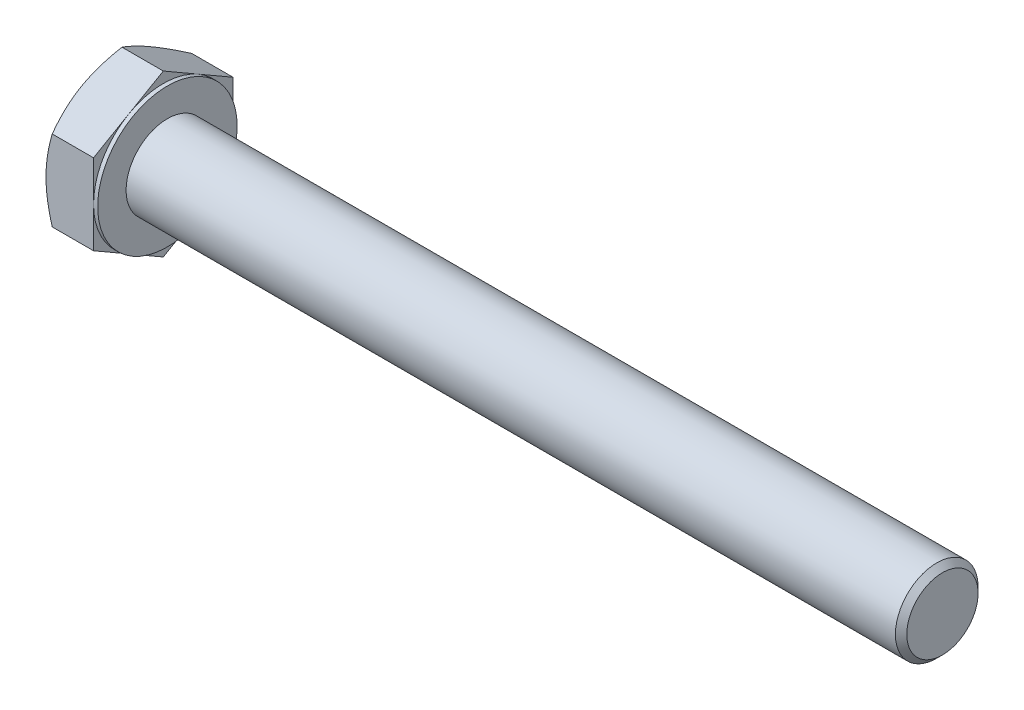
ISO-10303-21;
HEADER;
FILE_DESCRIPTION(('STEP AP214'),'2;1');
FILE_NAME('part.step','',(''),(''),'','','');
FILE_SCHEMA(('AUTOMOTIVE_DESIGN { 1 0 10303 214 1 1 1 1 }'));
ENDSEC;
DATA;
#1=APPLICATION_CONTEXT('core data for automotive mechanical design processes');
#2=APPLICATION_PROTOCOL_DEFINITION('international standard','automotive_design',2000,#1);
#3=PRODUCT_CONTEXT('',#1,'mechanical');
#4=PRODUCT('Part','Part','',(#3));
#5=PRODUCT_RELATED_PRODUCT_CATEGORY('part','',(#4));
#6=PRODUCT_DEFINITION_FORMATION('','',#4);
#7=PRODUCT_DEFINITION_CONTEXT('part definition',#1,'design');
#8=PRODUCT_DEFINITION('design','',#6,#7);
#9=PRODUCT_DEFINITION_SHAPE('','',#8);
#10=(LENGTH_UNIT() NAMED_UNIT(*) SI_UNIT(.MILLI.,.METRE.));
#11=(NAMED_UNIT(*) PLANE_ANGLE_UNIT() SI_UNIT($,.RADIAN.));
#12=(NAMED_UNIT(*) SI_UNIT($,.STERADIAN.) SOLID_ANGLE_UNIT());
#13=UNCERTAINTY_MEASURE_WITH_UNIT(LENGTH_MEASURE(1.E-05),#10,'distance_accuracy_value','');
#14=(GEOMETRIC_REPRESENTATION_CONTEXT(3) GLOBAL_UNCERTAINTY_ASSIGNED_CONTEXT((#13)) GLOBAL_UNIT_ASSIGNED_CONTEXT((#10,
#11,#12)) REPRESENTATION_CONTEXT('',''));
#15=CARTESIAN_POINT('',(0.,0.,0.));
#16=DIRECTION('',(0.,0.,1.));
#17=DIRECTION('',(1.,0.,0.));
#18=AXIS2_PLACEMENT_3D('',#15,#16,#17);
#19=CARTESIAN_POINT('',(10.,0.,-27.));
#20=DIRECTION('',(1.,0.,0.));
#21=DIRECTION('',(0.,0.,-1.));
#22=AXIS2_PLACEMENT_3D('',#19,#20,#21);
#23=PLANE('',#22);
#24=CARTESIAN_POINT('',(10.,0.,0.));
#25=DIRECTION('',(1.,0.,0.));
#26=DIRECTION('',(0.,0.,-1.));
#27=AXIS2_PLACEMENT_3D('',#24,#25,#26);
#28=CIRCLE('',#27,8.);
#29=CARTESIAN_POINT('',(10.,0.,-8.));
#30=VERTEX_POINT('',#29);
#31=EDGE_CURVE('E279',#30,#30,#28,.F.);
#32=ORIENTED_EDGE('',*,*,#31,.T.);
#33=EDGE_LOOP('',(#32));
#34=FACE_BOUND('',#33,.T.);
#35=CARTESIAN_POINT('',(10.,0.,0.));
#36=DIRECTION('',(1.,0.,0.));
#37=DIRECTION('',(0.,0.,-1.));
#38=AXIS2_PLACEMENT_3D('',#35,#36,#37);
#39=CIRCLE('',#38,13.5);
#40=CARTESIAN_POINT('',(10.,0.,-13.5));
#41=VERTEX_POINT('',#40);
#42=EDGE_CURVE('E298',#41,#41,#39,.T.);
#43=ORIENTED_EDGE('',*,*,#42,.T.);
#44=EDGE_LOOP('',(#43));
#45=FACE_BOUND('',#44,.T.);
#46=ADVANCED_FACE('F35',(#34,#45),#23,.T.);
#47=CARTESIAN_POINT('',(0.,0.,0.));
#48=DIRECTION('',(-1.,0.,0.));
#49=DIRECTION('',(0.,0.,1.));
#50=AXIS2_PLACEMENT_3D('',#47,#48,#49);
#51=CYLINDRICAL_SURFACE('',#50,8.);
#52=ORIENTED_EDGE('',*,*,#31,.F.);
#53=EDGE_LOOP('',(#52));
#54=FACE_BOUND('',#53,.T.);
#55=CARTESIAN_POINT('',(158.8985,0.,0.));
#56=DIRECTION('',(-1.,0.,0.));
#57=DIRECTION('',(0.,0.,1.));
#58=AXIS2_PLACEMENT_3D('',#55,#56,#57);
#59=CIRCLE('',#58,7.99999999999999);
#60=CARTESIAN_POINT('',(158.8985,0.,7.99999999999999));
#61=VERTEX_POINT('',#60);
#62=EDGE_CURVE('E276',#61,#61,#59,.T.);
#63=ORIENTED_EDGE('',*,*,#62,.T.);
#64=EDGE_LOOP('',(#63));
#65=FACE_BOUND('',#64,.T.);
#66=ADVANCED_FACE('F250',(#54,#65),#51,.T.);
#67=CARTESIAN_POINT('',(160.,0.,0.));
#68=DIRECTION('',(-1.,0.,0.));
#69=DIRECTION('',(0.,0.,1.));
#70=AXIS2_PLACEMENT_3D('',#67,#68,#69);
#71=CONICAL_SURFACE('',#70,6.8985,0.785398163397418);
#72=ORIENTED_EDGE('',*,*,#62,.F.);
#73=EDGE_LOOP('',(#72));
#74=FACE_BOUND('',#73,.T.);
#75=CARTESIAN_POINT('',(160.,0.,0.));
#76=DIRECTION('',(-1.,0.,0.));
#77=DIRECTION('',(0.,0.,1.));
#78=AXIS2_PLACEMENT_3D('',#75,#76,#77);
#79=CIRCLE('',#78,6.8985);
#80=CARTESIAN_POINT('',(160.,0.,6.8985));
#81=VERTEX_POINT('',#80);
#82=EDGE_CURVE('E274',#81,#81,#79,.T.);
#83=ORIENTED_EDGE('',*,*,#82,.T.);
#84=EDGE_LOOP('',(#83));
#85=FACE_BOUND('',#84,.T.);
#86=ADVANCED_FACE('F255',(#74,#85),#71,.T.);
#87=CARTESIAN_POINT('',(160.,0.,0.));
#88=DIRECTION('',(-1.,0.,0.));
#89=DIRECTION('',(0.,0.,1.));
#90=AXIS2_PLACEMENT_3D('',#87,#88,#89);
#91=PLANE('',#90);
#92=ORIENTED_EDGE('',*,*,#82,.F.);
#93=EDGE_LOOP('',(#92));
#94=FACE_BOUND('',#93,.T.);
#95=ADVANCED_FACE('F262',(#94),#91,.F.);
#96=CARTESIAN_POINT('',(9.2,13.5,0.));
#97=DIRECTION('',(1.,0.,0.));
#98=DIRECTION('',(0.,0.,-1.));
#99=AXIS2_PLACEMENT_3D('',#96,#97,#98);
#100=PLANE('',#99);
#101=DIRECTION('',(0.,0.500000000000001,0.866025403784438));
#102=VECTOR('',#101,1.);
#103=CARTESIAN_POINT('',(9.2,7.79422863405995,-13.5));
#104=LINE('',#103,#102);
#105=CARTESIAN_POINT('',(9.2,7.79422863405995,-13.5));
#106=VERTEX_POINT('',#105);
#107=CARTESIAN_POINT('',(9.2,11.6913429510899,-6.75000000000001));
#108=VERTEX_POINT('',#107);
#109=EDGE_CURVE('E168',#106,#108,#104,.T.);
#110=ORIENTED_EDGE('',*,*,#109,.T.);
#111=CARTESIAN_POINT('',(9.2,0.,0.));
#112=DIRECTION('',(-1.,0.,0.));
#113=DIRECTION('',(0.,0.,1.));
#114=AXIS2_PLACEMENT_3D('',#111,#112,#113);
#115=CIRCLE('',#114,13.5);
#116=CARTESIAN_POINT('',(9.2,0.,-13.5));
#117=VERTEX_POINT('',#116);
#118=EDGE_CURVE('E51',#108,#117,#115,.T.);
#119=ORIENTED_EDGE('',*,*,#118,.T.);
#120=DIRECTION('',(0.,1.,0.));
#121=VECTOR('',#120,1.);
#122=CARTESIAN_POINT('',(9.2,7.79422863405995,-13.5));
#123=LINE('',#122,#121);
#124=EDGE_CURVE('E40',#117,#106,#123,.T.);
#125=ORIENTED_EDGE('',*,*,#124,.T.);
#126=EDGE_LOOP('',(#110,#119,#125));
#127=FACE_BOUND('',#126,.T.);
#128=ADVANCED_FACE('F265',(#127),#100,.T.);
#129=CARTESIAN_POINT('',(9.2,15.5884572681199,0.));
#130=VERTEX_POINT('',#129);
#131=EDGE_CURVE('E166',#108,#130,#104,.T.);
#132=ORIENTED_EDGE('',*,*,#131,.T.);
#133=DIRECTION('',(0.,-0.500000000000001,0.866025403784438));
#134=VECTOR('',#133,1.);
#135=CARTESIAN_POINT('',(9.2,15.5884572681199,0.));
#136=LINE('',#135,#134);
#137=CARTESIAN_POINT('',(9.2,11.6913429510899,6.75000000000001));
#138=VERTEX_POINT('',#137);
#139=EDGE_CURVE('E165',#130,#138,#136,.T.);
#140=ORIENTED_EDGE('',*,*,#139,.T.);
#141=EDGE_CURVE('E154',#138,#108,#115,.T.);
#142=ORIENTED_EDGE('',*,*,#141,.T.);
#143=EDGE_LOOP('',(#132,#140,#142));
#144=FACE_BOUND('',#143,.T.);
#145=ADVANCED_FACE('F270',(#144),#100,.T.);
#146=CARTESIAN_POINT('',(9.2,7.79422863405994,13.5));
#147=VERTEX_POINT('',#146);
#148=EDGE_CURVE('E133',#138,#147,#136,.T.);
#149=ORIENTED_EDGE('',*,*,#148,.T.);
#150=DIRECTION('',(0.,-1.,0.));
#151=VECTOR('',#150,1.);
#152=CARTESIAN_POINT('',(9.2,7.79422863405994,13.5));
#153=LINE('',#152,#151);
#154=CARTESIAN_POINT('',(9.2,0.,13.5));
#155=VERTEX_POINT('',#154);
#156=EDGE_CURVE('E127',#147,#155,#153,.T.);
#157=ORIENTED_EDGE('',*,*,#156,.T.);
#158=EDGE_CURVE('E131',#155,#138,#115,.T.);
#159=ORIENTED_EDGE('',*,*,#158,.T.);
#160=EDGE_LOOP('',(#149,#157,#159));
#161=FACE_BOUND('',#160,.T.);
#162=ADVANCED_FACE('F129',(#161),#100,.T.);
#163=CARTESIAN_POINT('',(9.2,-7.79422863405997,13.5));
#164=VERTEX_POINT('',#163);
#165=EDGE_CURVE('E137',#155,#164,#153,.T.);
#166=ORIENTED_EDGE('',*,*,#165,.T.);
#167=DIRECTION('',(0.,-0.500000000000001,-0.866025403784438));
#168=VECTOR('',#167,1.);
#169=CARTESIAN_POINT('',(9.2,-15.5884572681199,0.));
#170=LINE('',#169,#168);
#171=CARTESIAN_POINT('',(9.2,-11.6913429510899,6.75000000000001));
#172=VERTEX_POINT('',#171);
#173=EDGE_CURVE('E144',#164,#172,#170,.T.);
#174=ORIENTED_EDGE('',*,*,#173,.T.);
#175=EDGE_CURVE('E141',#172,#155,#115,.T.);
#176=ORIENTED_EDGE('',*,*,#175,.T.);
#177=EDGE_LOOP('',(#166,#174,#176));
#178=FACE_BOUND('',#177,.T.);
#179=ADVANCED_FACE('F142',(#178),#100,.T.);
#180=CARTESIAN_POINT('',(9.2,-15.5884572681199,0.));
#181=VERTEX_POINT('',#180);
#182=EDGE_CURVE('E160',#172,#181,#170,.T.);
#183=ORIENTED_EDGE('',*,*,#182,.T.);
#184=DIRECTION('',(0.,0.500000000000002,-0.866025403784438));
#185=VECTOR('',#184,1.);
#186=CARTESIAN_POINT('',(9.2,-7.79422863405996,-13.5));
#187=LINE('',#186,#185);
#188=CARTESIAN_POINT('',(9.2,-11.6913429510899,-6.75000000000002));
#189=VERTEX_POINT('',#188);
#190=EDGE_CURVE('E334',#181,#189,#187,.T.);
#191=ORIENTED_EDGE('',*,*,#190,.T.);
#192=EDGE_CURVE('E148',#189,#172,#115,.T.);
#193=ORIENTED_EDGE('',*,*,#192,.T.);
#194=EDGE_LOOP('',(#183,#191,#193));
#195=FACE_BOUND('',#194,.T.);
#196=ADVANCED_FACE('F339',(#195),#100,.T.);
#197=CARTESIAN_POINT('',(9.2,-7.79422863405996,-13.5));
#198=VERTEX_POINT('',#197);
#199=EDGE_CURVE('E155',#189,#198,#187,.T.);
#200=ORIENTED_EDGE('',*,*,#199,.T.);
#201=EDGE_CURVE('E11',#198,#117,#123,.T.);
#202=ORIENTED_EDGE('',*,*,#201,.T.);
#203=EDGE_CURVE('E352',#117,#189,#115,.T.);
#204=ORIENTED_EDGE('',*,*,#203,.T.);
#205=EDGE_LOOP('',(#200,#202,#204));
#206=FACE_BOUND('',#205,.T.);
#207=ADVANCED_FACE('F271',(#206),#100,.T.);
#208=CARTESIAN_POINT('',(0.,0.,0.));
#209=DIRECTION('',(-1.,0.,0.));
#210=DIRECTION('',(0.,0.,1.));
#211=AXIS2_PLACEMENT_3D('',#208,#209,#210);
#212=CYLINDRICAL_SURFACE('',#211,13.5);
#213=ORIENTED_EDGE('',*,*,#118,.F.);
#214=ORIENTED_EDGE('',*,*,#141,.F.);
#215=ORIENTED_EDGE('',*,*,#158,.F.);
#216=ORIENTED_EDGE('',*,*,#175,.F.);
#217=ORIENTED_EDGE('',*,*,#192,.F.);
#218=ORIENTED_EDGE('',*,*,#203,.F.);
#219=EDGE_LOOP('',(#213,#214,#215,#216,#217,#218));
#220=FACE_BOUND('',#219,.T.);
#221=ORIENTED_EDGE('',*,*,#42,.F.);
#222=EDGE_LOOP('',(#221));
#223=FACE_BOUND('',#222,.T.);
#224=ADVANCED_FACE('F151',(#220,#223),#212,.T.);
#225=CARTESIAN_POINT('',(0.,0.,-27.));
#226=DIRECTION('',(1.,0.,0.));
#227=DIRECTION('',(0.,0.,-1.));
#228=AXIS2_PLACEMENT_3D('',#225,#226,#227);
#229=PLANE('',#228);
#230=CARTESIAN_POINT('',(0.,0.,0.));
#231=DIRECTION('',(1.,0.,0.));
#232=DIRECTION('',(0.,0.,-1.));
#233=AXIS2_PLACEMENT_3D('',#230,#231,#232);
#234=CIRCLE('',#233,13.5);
#235=CARTESIAN_POINT('',(0.,0.,-13.5));
#236=VERTEX_POINT('',#235);
#237=CARTESIAN_POINT('',(0.,11.6913429510899,-6.75000000000001));
#238=VERTEX_POINT('',#237);
#239=EDGE_CURVE('E297',#236,#238,#234,.T.);
#240=ORIENTED_EDGE('',*,*,#239,.F.);
#241=CARTESIAN_POINT('',(0.,-11.6913429510899,-6.75000000000002));
#242=VERTEX_POINT('',#241);
#243=EDGE_CURVE('E294',#242,#236,#234,.T.);
#244=ORIENTED_EDGE('',*,*,#243,.F.);
#245=CARTESIAN_POINT('',(0.,-11.6913429510899,6.75000000000001));
#246=VERTEX_POINT('',#245);
#247=EDGE_CURVE('E296',#246,#242,#234,.T.);
#248=ORIENTED_EDGE('',*,*,#247,.F.);
#249=CARTESIAN_POINT('',(0.,0.,13.5));
#250=VERTEX_POINT('',#249);
#251=EDGE_CURVE('E306',#250,#246,#234,.T.);
#252=ORIENTED_EDGE('',*,*,#251,.F.);
#253=CARTESIAN_POINT('',(0.,0.,0.));
#254=DIRECTION('',(-1.,0.,0.));
#255=DIRECTION('',(0.,0.,1.));
#256=AXIS2_PLACEMENT_3D('',#253,#254,#255);
#257=CIRCLE('',#256,13.5);
#258=CARTESIAN_POINT('',(0.,11.6913429510899,6.75000000000001));
#259=VERTEX_POINT('',#258);
#260=EDGE_CURVE('E169',#250,#259,#257,.T.);
#261=ORIENTED_EDGE('',*,*,#260,.T.);
#262=EDGE_CURVE('E301',#238,#259,#234,.T.);
#263=ORIENTED_EDGE('',*,*,#262,.F.);
#264=EDGE_LOOP('',(#240,#244,#248,#252,#261,#263));
#265=FACE_BOUND('',#264,.T.);
#266=ADVANCED_FACE('F200',(#265),#229,.F.);
#267=CARTESIAN_POINT('',(0.,0.,0.));
#268=DIRECTION('',(1.,0.,0.));
#269=DIRECTION('',(0.,0.,-1.));
#270=AXIS2_PLACEMENT_3D('',#267,#268,#269);
#271=CONICAL_SURFACE('',#270,13.5,1.0471975511966);
#272=CARTESIAN_POINT('',(1.20583803334745,7.7941131640061,13.5002));
#273=CARTESIAN_POINT('',(1.10693600185288,7.96542734310489,13.2034751377439));
#274=CARTESIAN_POINT('',(1.01252193890574,8.13740973961965,12.9055928889729));
#275=CARTESIAN_POINT('',(0.833917254878252,8.48275363037183,12.3074397241066));
#276=CARTESIAN_POINT('',(0.749729996263839,8.65611555833004,12.0071680567849));
#277=CARTESIAN_POINT('',(0.59271056683562,9.00455355753,11.403655738883));
#278=CARTESIAN_POINT('',(0.519905262595243,9.17963267786846,11.1004098071123));
#279=CARTESIAN_POINT('',(0.387213084407289,9.53100751002426,10.4918107453174));
#280=CARTESIAN_POINT('',(0.327325473477574,9.7073031518439,10.1864577365329));
#281=CARTESIAN_POINT('',(0.223015910639065,10.0565936504728,9.58146884630663));
#282=CARTESIAN_POINT('',(0.178248713624553,10.2295625754616,9.28187788009545));
#283=CARTESIAN_POINT('',(0.103183935683265,10.5762930076628,8.68132315499259));
#284=CARTESIAN_POINT('',(0.0728866332670135,10.7500545300658,8.38035936979001));
#285=CARTESIAN_POINT('',(0.0275266341970806,11.0978694745929,7.77792621423743));
#286=CARTESIAN_POINT('',(0.0124458340286939,11.2719223024903,7.47645787311809));
#287=CARTESIAN_POINT('',(-0.00215683633239659,11.6201886315474,6.87324289662572));
#288=CARTESIAN_POINT('',(-0.00167918727246611,11.7944021275762,6.57149627013965));
#289=CARTESIAN_POINT('',(0.013748333644569,12.1200937136619,6.00738189544143));
#290=CARTESIAN_POINT('',(0.0268164189930331,12.271595012447,5.74497394853305));
#291=CARTESIAN_POINT('',(0.0644725699586027,12.5742491226741,5.22076165250011));
#292=CARTESIAN_POINT('',(0.0890614504269884,12.7254019087062,4.95895734738682));
#293=CARTESIAN_POINT('',(0.149330465436026,13.0272768920407,4.43609453871757));
#294=CARTESIAN_POINT('',(0.18501976050714,13.1779986295677,4.17503683151572));
#295=CARTESIAN_POINT('',(0.266863438712337,13.4787354904687,3.65414530872635));
#296=CARTESIAN_POINT('',(0.313018533291664,13.6287505650972,3.39431157756869));
#297=CARTESIAN_POINT('',(0.468349259272661,14.0841296870377,2.60557180166153));
#298=CARTESIAN_POINT('',(0.593013033425393,14.3881750256073,2.07894982745447));
#299=CARTESIAN_POINT('',(0.875948867571989,14.9917319951217,1.03355849099334));
#300=CARTESIAN_POINT('',(1.03415447837321,15.2912513537195,0.51477574405152));
#301=CARTESIAN_POINT('',(1.20583803334745,15.5885727381737,-0.000199999999998264));
#302=B_SPLINE_CURVE_WITH_KNOTS('',3,(#272,#273,#274,#275,#276,#277,#278,#279,#280,#281,#282,
#283,#284,#285,#286,#287,#288,#289,#290,#291,#292,#293,#294,#295,#296,#297,#298,#299,#300,#301),
.UNSPECIFIED.,.F.,.F.,(4,2,2,2,2,2,2,2,2,2,2,2,2,2,4),(0.,1.0698794936454,2.14010980578041,
3.21282939735429,4.28548777177525,5.33167033690336,6.37787303770781,7.42282956789444,
8.46775380954026,9.37738732544599,10.2870851882952,11.1975357730373,12.1080482670513,
13.9691139233208,15.8265265395635),.UNSPECIFIED.);
#303=CARTESIAN_POINT('',(1.20577136594005,15.5884572681199,0.));
#304=VERTEX_POINT('',#303);
#305=EDGE_CURVE('E219',#259,#304,#302,.T.);
#306=ORIENTED_EDGE('',*,*,#305,.T.);
#307=CARTESIAN_POINT('',(1.20583803334746,15.5885727381737,0.0002));
#308=CARTESIAN_POINT('',(1.10693600185289,15.417258559075,-0.296524862256054));
#309=CARTESIAN_POINT('',(1.01252193890575,15.2452761625602,-0.594407111027073));
#310=CARTESIAN_POINT('',(0.83391725487826,14.899932271808,-1.19256027589336));
#311=CARTESIAN_POINT('',(0.749729996263846,14.7265703438498,-1.49283194321508));
#312=CARTESIAN_POINT('',(0.592710566835626,14.3781323446499,-2.09634426111705));
#313=CARTESIAN_POINT('',(0.519905262595249,14.2030532243114,-2.39959019288773));
#314=CARTESIAN_POINT('',(0.387213084407294,13.8516783921556,-3.00818925468256));
#315=CARTESIAN_POINT('',(0.327325473477579,13.6753827503359,-3.31354226346714));
#316=CARTESIAN_POINT('',(0.223015910639069,13.3260922517071,-3.91853115369338));
#317=CARTESIAN_POINT('',(0.178248713624556,13.1531233267183,-4.21812211990456));
#318=CARTESIAN_POINT('',(0.103183935683268,12.8063928945171,-4.81867684500742));
#319=CARTESIAN_POINT('',(0.0728866332670166,12.632631372114,-5.11964063020999));
#320=CARTESIAN_POINT('',(0.0275266341970835,12.284816427587,-5.72207378576257));
#321=CARTESIAN_POINT('',(0.0124458340286968,12.1107635996896,-6.02354212688191));
#322=CARTESIAN_POINT('',(-0.00215683633239496,11.7624972706325,-6.62675710337429));
#323=CARTESIAN_POINT('',(-0.00167918727246577,11.5882837746037,-6.92850372986036));
#324=CARTESIAN_POINT('',(0.0137483336445682,11.2625921885179,-7.49261810455858));
#325=CARTESIAN_POINT('',(0.0268164189930321,11.1110908897329,-7.75502605146696));
#326=CARTESIAN_POINT('',(0.0644725699586015,10.8084367795058,-8.27923834749989));
#327=CARTESIAN_POINT('',(0.0890614504269871,10.6572839934736,-8.54104265261318));
#328=CARTESIAN_POINT('',(0.149330465436024,10.3554090101392,-9.06390546128244));
#329=CARTESIAN_POINT('',(0.185019760507137,10.2046872726121,-9.32496316848429));
#330=CARTESIAN_POINT('',(0.266863438712333,9.90395041171111,-9.84585469127366));
#331=CARTESIAN_POINT('',(0.31301853329166,9.75393533708269,-10.1056884224313));
#332=CARTESIAN_POINT('',(0.468349259272656,9.29855621514213,-10.8944281983385));
#333=CARTESIAN_POINT('',(0.593013033425386,8.99451087657251,-11.4210501725455));
#334=CARTESIAN_POINT('',(0.875948867571981,8.39095390705817,-12.4664415090067));
#335=CARTESIAN_POINT('',(1.0341544783732,8.09143454846038,-12.9852242559485));
#336=CARTESIAN_POINT('',(1.20583803334744,7.79411316400611,-13.5002));
#337=B_SPLINE_CURVE_WITH_KNOTS('',3,(#307,#308,#309,#310,#311,#312,#313,#314,#315,#316,#317,
#318,#319,#320,#321,#322,#323,#324,#325,#326,#327,#328,#329,#330,#331,#332,#333,#334,#335,#336),
.UNSPECIFIED.,.F.,.F.,(4,2,2,2,2,2,2,2,2,2,2,2,2,2,4),(0.,1.0698794936454,2.14010980578041,
3.21282939735429,4.28548777177525,5.33167033690336,6.37787303770782,7.42282956789444,
8.46775380954027,9.377387325446,10.2870851882952,11.1975357730374,12.1080482670513,
13.9691139233208,15.8265265395635),.UNSPECIFIED.);
#338=EDGE_CURVE('E59',#304,#238,#337,.T.);
#339=ORIENTED_EDGE('',*,*,#338,.T.);
#340=ORIENTED_EDGE('',*,*,#262,.T.);
#341=EDGE_LOOP('',(#306,#339,#340));
#342=FACE_BOUND('',#341,.T.);
#343=ADVANCED_FACE('F348',(#342),#271,.T.);
#344=CARTESIAN_POINT('',(6.65552250495168,-21.0745325912132,13.5));
#345=CARTESIAN_POINT('',(6.51192131965383,-20.7791464058323,13.5));
#346=CARTESIAN_POINT('',(6.36902580534212,-20.4834173215818,13.5));
#347=CARTESIAN_POINT('',(6.08480566588024,-19.891201849661,13.5));
#348=CARTESIAN_POINT('',(5.94348105610732,-19.5947154546124,13.5));
#349=CARTESIAN_POINT('',(5.52206654710981,-18.7039359898517,13.5));
#350=CARTESIAN_POINT('',(5.24457752621023,-18.1084078939184,13.5));
#351=CARTESIAN_POINT('',(4.69672238464207,-16.9102372700575,13.5));
#352=CARTESIAN_POINT('',(4.42640208158636,-16.3075737428369,13.5));
#353=CARTESIAN_POINT('',(3.89663579850199,-15.0975022908283,13.5));
#354=CARTESIAN_POINT('',(3.63718931395404,-14.4900945877137,13.5));
#355=CARTESIAN_POINT('',(3.12369893947337,-13.2494069073505,13.5));
#356=CARTESIAN_POINT('',(2.87011645502372,-12.6159349800556,13.5));
#357=CARTESIAN_POINT('',(2.38180982352809,-11.3416266475287,13.5));
#358=CARTESIAN_POINT('',(2.14708777368625,-10.7007894323375,13.5));
#359=CARTESIAN_POINT('',(1.7025666797361,-9.41190712282998,13.5));
#360=CARTESIAN_POINT('',(1.49271834821404,-8.76387916273802,13.5));
#361=CARTESIAN_POINT('',(1.10457449552646,-7.45846720316,13.5));
#362=CARTESIAN_POINT('',(0.926269180857169,-6.80108617635231,13.5));
#363=CARTESIAN_POINT('',(0.689343391492085,-5.80970729773045,13.5));
#364=CARTESIAN_POINT('',(0.615621316462401,-5.47929754824041,13.5));
#365=CARTESIAN_POINT('',(0.479218121726777,-4.81619500784246,13.5));
#366=CARTESIAN_POINT('',(0.416536782037626,-4.48350226255978,13.5));
#367=CARTESIAN_POINT('',(0.303312809434875,-3.81605303016931,13.5));
#368=CARTESIAN_POINT('',(0.252769967446801,-3.48129657870884,13.5));
#369=CARTESIAN_POINT('',(0.164825873705829,-2.81006324352113,13.5));
#370=CARTESIAN_POINT('',(0.127424101516916,-2.47358642846236,13.5));
#371=CARTESIAN_POINT('',(0.0669819137111165,-1.80383571610778,13.5));
#372=CARTESIAN_POINT('',(0.0437576325332676,-1.47057851441349,13.5));
#373=CARTESIAN_POINT('',(0.0114301437540873,-0.803380769868879,13.5));
#374=CARTESIAN_POINT('',(0.00232669798565324,-0.469440238638968,13.5));
#375=CARTESIAN_POINT('',(-0.00154201275903303,0.19852689464012,13.5));
#376=CARTESIAN_POINT('',(0.00369274805280051,0.53255349684302,13.5));
#377=CARTESIAN_POINT('',(0.0283710664469044,1.20008515073968,13.5));
#378=CARTESIAN_POINT('',(0.0478152523229306,1.53359017871766,13.5));
#379=CARTESIAN_POINT('',(0.110874417403471,2.33095876873584,13.5));
#380=CARTESIAN_POINT('',(0.16100056799455,2.79431674635736,13.5));
#381=CARTESIAN_POINT('',(0.285984098802111,3.71768710859735,13.5));
#382=CARTESIAN_POINT('',(0.360844727080064,4.17769904571072,13.5));
#383=CARTESIAN_POINT('',(0.53263439097848,5.09390714685298,13.5));
#384=CARTESIAN_POINT('',(0.62958022331539,5.55010013120953,13.5));
#385=CARTESIAN_POINT('',(0.842574156780339,6.45795589096167,13.5));
#386=CARTESIAN_POINT('',(0.958622001211244,6.90961872714789,13.5));
#387=CARTESIAN_POINT('',(1.20975308172246,7.81842814998751,13.5));
#388=CARTESIAN_POINT('',(1.34520276420359,8.27547276919518,13.5));
#389=CARTESIAN_POINT('',(1.63037567165068,9.18506172599706,13.5));
#390=CARTESIAN_POINT('',(1.78009899260467,9.63760603330475,13.5));
#391=CARTESIAN_POINT('',(2.09141761032543,10.5384131278266,13.5));
#392=CARTESIAN_POINT('',(2.2530091482963,10.986677220241,13.5));
#393=CARTESIAN_POINT('',(2.58613586655752,11.8794725453459,13.5));
#394=CARTESIAN_POINT('',(2.75767091863968,12.3240038260814,13.5));
#395=CARTESIAN_POINT('',(3.18025624760455,13.3892782836475,13.5));
#396=CARTESIAN_POINT('',(3.43535483887552,14.0084132883588,13.5));
#397=CARTESIAN_POINT('',(3.95837880975389,15.2412584701716,13.5));
#398=CARTESIAN_POINT('',(4.22630505867306,15.8549682762671,13.5));
#399=CARTESIAN_POINT('',(4.77236357831711,17.0779981981638,13.5));
#400=CARTESIAN_POINT('',(5.05049833311978,17.6873172017998,13.5));
#401=CARTESIAN_POINT('',(5.6148702751147,18.9021637926335,13.5));
#402=CARTESIAN_POINT('',(5.90110727081901,19.5076914690229,13.5));
#403=CARTESIAN_POINT('',(6.48047787553089,20.7163040814209,13.5));
#404=CARTESIAN_POINT('',(6.77361916133141,21.3193853307735,13.5));
#405=CARTESIAN_POINT('',(7.36527607850463,22.5229054555965,13.5));
#406=CARTESIAN_POINT('',(7.66379173547757,23.1233443184633,13.5));
#407=CARTESIAN_POINT('',(8.26521723033141,24.3219086940862,13.5));
#408=CARTESIAN_POINT('',(8.56812644134661,24.9200345217343,13.5));
#409=CARTESIAN_POINT('',(9.17764891450146,26.1143969327797,13.5));
#410=CARTESIAN_POINT('',(9.48426219155985,26.7106335085556,13.5));
#411=CARTESIAN_POINT('',(10.3554001639816,28.3938429255261,13.5));
#412=CARTESIAN_POINT('',(10.9235502093501,29.4789393963536,13.5));
#413=CARTESIAN_POINT('',(12.0675588478843,31.6451050831007,13.5));
#414=CARTESIAN_POINT('',(12.6434177389315,32.7261741413195,13.5));
#415=CARTESIAN_POINT('',(13.7994904405044,34.8823093902718,13.5));
#416=CARTESIAN_POINT('',(14.3796887590139,35.9573838932129,13.5));
#417=CARTESIAN_POINT('',(15.2533946206875,37.5681041358021,13.5));
#418=CARTESIAN_POINT('',(15.5451895383682,38.1046802403169,13.5));
#419=CARTESIAN_POINT('',(16.129801129039,39.1772745244478,13.5));
#420=CARTESIAN_POINT('',(16.4226178004543,39.7132927049222,13.5));
#421=CARTESIAN_POINT('',(16.71588588851,40.2490638615174,13.5));
#422=B_SPLINE_CURVE_WITH_KNOTS('',3,(#344,#345,#346,#347,#348,#349,#350,#351,#352,#353,#354,
#355,#356,#357,#358,#359,#360,#361,#362,#363,#364,#365,#366,#367,#368,#369,#370,#371,#372,#373,
#374,#375,#376,#377,#378,#379,#380,#381,#382,#383,#384,#385,#386,#387,#388,#389,#390,#391,#392,
#393,#394,#395,#396,#397,#398,#399,#400,#401,#402,#403,#404,#405,#406,#407,#408,#409,#410,#411,
#412,#413,#414,#415,#416,#417,#418,#419,#420,#421),.UNSPECIFIED.,.F.,.F.,(4,2,2,2,2,2,2,2,2,2,2,
2,2,2,2,2,2,2,2,2,2,2,2,2,2,2,2,2,2,2,2,2,2,2,2,2,2,2,4),(0.,0.985324951122011,1.97065953889851,
3.94161322800507,5.92306611644916,7.90442696819133,9.95122396090018,11.9982482351106,
14.0411459982621,16.0834083632249,17.0988569842377,18.1142853704641,19.1296962656147,
20.1450669421231,21.1469730260158,22.1488622112154,23.1507531983712,24.1526884885118,
25.5501026121931,26.947700313315,28.3463645153709,29.745009923397,31.1748114857401,
32.6046226639565,34.0339829417775,35.463324794027,37.4720142115936,39.4808399483455,
41.4901577845393,43.4994281722061,45.5110492723814,47.5226799572338,49.5340263951322,
51.5453809367633,55.219848669973,58.8944588024731,62.5593771469719,64.3917310188991,
66.2240820679584),.UNSPECIFIED.);
#423=CARTESIAN_POINT('',(1.20577136594004,7.79422863405994,13.5));
#424=VERTEX_POINT('',#423);
#425=EDGE_CURVE('E233',#250,#424,#422,.T.);
#426=ORIENTED_EDGE('',*,*,#425,.T.);
#427=EDGE_CURVE('E232',#424,#259,#302,.T.);
#428=ORIENTED_EDGE('',*,*,#427,.T.);
#429=ORIENTED_EDGE('',*,*,#260,.F.);
#430=EDGE_LOOP('',(#426,#428,#429));
#431=FACE_BOUND('',#430,.T.);
#432=ADVANCED_FACE('F344',(#431),#271,.T.);
#433=CARTESIAN_POINT('',(1.20577136594006,-7.79422863405997,13.5));
#434=VERTEX_POINT('',#433);
#435=EDGE_CURVE('E277',#434,#250,#422,.T.);
#436=ORIENTED_EDGE('',*,*,#435,.T.);
#437=ORIENTED_EDGE('',*,*,#251,.T.);
#438=CARTESIAN_POINT('',(1.20583803334748,-15.5885727381738,-0.000200000000000005));
#439=CARTESIAN_POINT('',(1.10693600185291,-15.417258559075,0.296524862256055));
#440=CARTESIAN_POINT('',(1.01252193890577,-15.2452761625602,0.594407111027074));
#441=CARTESIAN_POINT('',(0.833917254878279,-14.8999322718081,1.19256027589337));
#442=CARTESIAN_POINT('',(0.749729996263865,-14.7265703438498,1.49283194321509));
#443=CARTESIAN_POINT('',(0.592710566835644,-14.3781323446499,2.09634426111705));
#444=CARTESIAN_POINT('',(0.519905262595267,-14.2030532243114,2.39959019288773));
#445=CARTESIAN_POINT('',(0.387213084407311,-13.8516783921556,3.00818925468257));
#446=CARTESIAN_POINT('',(0.327325473477596,-13.675382750336,3.31354226346714));
#447=CARTESIAN_POINT('',(0.223015910639085,-13.3260922517071,3.91853115369339));
#448=CARTESIAN_POINT('',(0.178248713624574,-13.1531233267183,4.21812211990456));
#449=CARTESIAN_POINT('',(0.103183935683285,-12.8063928945171,4.81867684500742));
#450=CARTESIAN_POINT('',(0.0728866332670338,-12.632631372114,5.11964063021));
#451=CARTESIAN_POINT('',(0.0275266341971003,-12.284816427587,5.72207378576258));
#452=CARTESIAN_POINT('',(0.0124458340287133,-12.1107635996896,6.02354212688193));
#453=CARTESIAN_POINT('',(-0.00215683633237895,-11.7624972706325,6.6267571033743));
#454=CARTESIAN_POINT('',(-0.00167918727245,-11.5882837746037,6.92850372986038));
#455=CARTESIAN_POINT('',(0.0137483336445844,-11.262592188518,7.49261810455859));
#456=CARTESIAN_POINT('',(0.0268164189930489,-11.1110908897329,7.75502605146697));
#457=CARTESIAN_POINT('',(0.0644725699586187,-10.8084367795058,8.27923834749991));
#458=CARTESIAN_POINT('',(0.0890614504270041,-10.6572839934736,8.5410426526132));
#459=CARTESIAN_POINT('',(0.149330465436041,-10.3554090101392,9.06390546128245));
#460=CARTESIAN_POINT('',(0.185019760507155,-10.2046872726122,9.3249631684843));
#461=CARTESIAN_POINT('',(0.26686343871235,-9.90395041171114,9.84585469127367));
#462=CARTESIAN_POINT('',(0.313018533291676,-9.75393533708272,10.1056884224313));
#463=CARTESIAN_POINT('',(0.468349259272671,-9.29855621514215,10.8944281983385));
#464=CARTESIAN_POINT('',(0.593013033425401,-8.99451087657253,11.4210501725455));
#465=CARTESIAN_POINT('',(0.875948867571995,-8.3909539070582,12.4664415090067));
#466=CARTESIAN_POINT('',(1.03415447837321,-8.0914345484604,12.9852242559485));
#467=CARTESIAN_POINT('',(1.20583803334746,-7.79411316400613,13.5002));
#468=B_SPLINE_CURVE_WITH_KNOTS('',3,(#438,#439,#440,#441,#442,#443,#444,#445,#446,#447,#448,
#449,#450,#451,#452,#453,#454,#455,#456,#457,#458,#459,#460,#461,#462,#463,#464,#465,#466,#467),
.UNSPECIFIED.,.F.,.F.,(4,2,2,2,2,2,2,2,2,2,2,2,2,2,4),(0.,1.06987949364541,2.14010980578042,
3.2128293973543,4.28548777177526,5.33167033690338,6.37787303770783,7.42282956789446,
8.46775380954029,9.37738732544602,10.2870851882952,11.1975357730374,12.1080482670513,
13.9691139233208,15.8265265395635),.UNSPECIFIED.);
#469=EDGE_CURVE('E221',#246,#434,#468,.T.);
#470=ORIENTED_EDGE('',*,*,#469,.T.);
#471=EDGE_LOOP('',(#436,#437,#470));
#472=FACE_BOUND('',#471,.T.);
#473=ADVANCED_FACE('F189',(#472),#271,.T.);
#474=CARTESIAN_POINT('',(1.20577136594007,-15.5884572681199,0.));
#475=VERTEX_POINT('',#474);
#476=EDGE_CURVE('E213',#475,#246,#468,.T.);
#477=ORIENTED_EDGE('',*,*,#476,.T.);
#478=ORIENTED_EDGE('',*,*,#247,.T.);
#479=CARTESIAN_POINT('',(1.20583803334745,-7.79411316400613,-13.5002));
#480=CARTESIAN_POINT('',(1.10693600185289,-7.96542734310491,-13.2034751377439));
#481=CARTESIAN_POINT('',(1.01252193890575,-8.13740973961967,-12.9055928889729));
#482=CARTESIAN_POINT('',(0.833917254878258,-8.48275363037185,-12.3074397241066));
#483=CARTESIAN_POINT('',(0.749729996263846,-8.65611555833007,-12.0071680567849));
#484=CARTESIAN_POINT('',(0.592710566835627,-9.00455355753002,-11.403655738883));
#485=CARTESIAN_POINT('',(0.51990526259525,-9.17963267786848,-11.1004098071123));
#486=CARTESIAN_POINT('',(0.387213084407297,-9.53100751002428,-10.4918107453174));
#487=CARTESIAN_POINT('',(0.327325473477583,-9.70730315184392,-10.1864577365329));
#488=CARTESIAN_POINT('',(0.223015910639074,-10.0565936504728,-9.58146884630662));
#489=CARTESIAN_POINT('',(0.178248713624563,-10.2295625754616,-9.28187788009544));
#490=CARTESIAN_POINT('',(0.103183935683276,-10.5762930076628,-8.68132315499258));
#491=CARTESIAN_POINT('',(0.072886633267026,-10.7500545300659,-8.38035936979001));
#492=CARTESIAN_POINT('',(0.0275266341970946,-11.0978694745929,-7.77792621423743));
#493=CARTESIAN_POINT('',(0.0124458340287085,-11.2719223024903,-7.47645787311809));
#494=CARTESIAN_POINT('',(-0.00215683633238164,-11.6201886315474,-6.87324289662571));
#495=CARTESIAN_POINT('',(-0.0016791872724514,-11.7944021275762,-6.57149627013964));
#496=CARTESIAN_POINT('',(0.0137483336445843,-12.1200937136619,-6.00738189544142));
#497=CARTESIAN_POINT('',(0.026816418993049,-12.271595012447,-5.74497394853304));
#498=CARTESIAN_POINT('',(0.0644725699586194,-12.5742491226741,-5.22076165250011));
#499=CARTESIAN_POINT('',(0.0890614504270051,-12.7254019087063,-4.95895734738682));
#500=CARTESIAN_POINT('',(0.149330465436043,-13.0272768920407,-4.43609453871756));
#501=CARTESIAN_POINT('',(0.185019760507158,-13.1779986295677,-4.17503683151571));
#502=CARTESIAN_POINT('',(0.266863438712356,-13.4787354904688,-3.65414530872634));
#503=CARTESIAN_POINT('',(0.313018533291683,-13.6287505650972,-3.39431157756869));
#504=CARTESIAN_POINT('',(0.468349259272681,-14.0841296870378,-2.60557180166152));
#505=CARTESIAN_POINT('',(0.593013033425412,-14.3881750256074,-2.07894982745447));
#506=CARTESIAN_POINT('',(0.875948867572009,-14.9917319951217,-1.03355849099333));
#507=CARTESIAN_POINT('',(1.03415447837323,-15.2912513537195,-0.514775744051517));
#508=CARTESIAN_POINT('',(1.20583803334748,-15.5885727381738,0.000200000000000026));
#509=B_SPLINE_CURVE_WITH_KNOTS('',3,(#479,#480,#481,#482,#483,#484,#485,#486,#487,#488,#489,
#490,#491,#492,#493,#494,#495,#496,#497,#498,#499,#500,#501,#502,#503,#504,#505,#506,#507,#508),
.UNSPECIFIED.,.F.,.F.,(4,2,2,2,2,2,2,2,2,2,2,2,2,2,4),(0.,1.0698794936454,2.14010980578041,
3.21282939735429,4.28548777177525,5.33167033690336,6.37787303770781,7.42282956789444,
8.46775380954027,9.377387325446,10.2870851882952,11.1975357730374,12.1080482670513,
13.9691139233208,15.8265265395635),.UNSPECIFIED.);
#510=EDGE_CURVE('E220',#242,#475,#509,.T.);
#511=ORIENTED_EDGE('',*,*,#510,.T.);
#512=EDGE_LOOP('',(#477,#478,#511));
#513=FACE_BOUND('',#512,.T.);
#514=ADVANCED_FACE('F315',(#513),#271,.T.);
#515=CARTESIAN_POINT('',(1.20577136594004,7.79422863405995,-13.5));
#516=VERTEX_POINT('',#515);
#517=EDGE_CURVE('E222',#238,#516,#337,.T.);
#518=ORIENTED_EDGE('',*,*,#517,.T.);
#519=CARTESIAN_POINT('',(6.65552250495167,-21.0745325912132,-13.5));
#520=CARTESIAN_POINT('',(6.51192131965382,-20.7791464058323,-13.5));
#521=CARTESIAN_POINT('',(6.36902580534211,-20.4834173215818,-13.5));
#522=CARTESIAN_POINT('',(6.08480566588023,-19.891201849661,-13.5));
#523=CARTESIAN_POINT('',(5.9434810561073,-19.5947154546124,-13.5));
#524=CARTESIAN_POINT('',(5.5220665471098,-18.7039359898517,-13.5));
#525=CARTESIAN_POINT('',(5.24457752621022,-18.1084078939184,-13.5));
#526=CARTESIAN_POINT('',(4.69672238464206,-16.9102372700575,-13.5));
#527=CARTESIAN_POINT('',(4.42640208158635,-16.3075737428369,-13.5));
#528=CARTESIAN_POINT('',(3.89663579850198,-15.0975022908283,-13.5));
#529=CARTESIAN_POINT('',(3.63718931395403,-14.4900945877137,-13.5));
#530=CARTESIAN_POINT('',(3.12369893947336,-13.2494069073505,-13.5));
#531=CARTESIAN_POINT('',(2.87011645502372,-12.6159349800556,-13.5));
#532=CARTESIAN_POINT('',(2.38180982352809,-11.3416266475287,-13.5));
#533=CARTESIAN_POINT('',(2.14708777368624,-10.7007894323374,-13.5));
#534=CARTESIAN_POINT('',(1.70256667973609,-9.41190712282998,-13.5));
#535=CARTESIAN_POINT('',(1.49271834821403,-8.76387916273802,-13.5));
#536=CARTESIAN_POINT('',(1.10457449552646,-7.45846720315999,-13.5));
#537=CARTESIAN_POINT('',(0.926269180857163,-6.80108617635231,-13.5));
#538=CARTESIAN_POINT('',(0.68934339149208,-5.80970729773045,-13.5));
#539=CARTESIAN_POINT('',(0.615621316462397,-5.47929754824041,-13.5));
#540=CARTESIAN_POINT('',(0.479218121726772,-4.81619500784246,-13.5));
#541=CARTESIAN_POINT('',(0.416536782037622,-4.48350226255978,-13.5));
#542=CARTESIAN_POINT('',(0.30331280943487,-3.81605303016931,-13.5));
#543=CARTESIAN_POINT('',(0.252769967446795,-3.48129657870884,-13.5));
#544=CARTESIAN_POINT('',(0.164825873705824,-2.81006324352113,-13.5));
#545=CARTESIAN_POINT('',(0.127424101516911,-2.47358642846236,-13.5));
#546=CARTESIAN_POINT('',(0.0669819137111124,-1.80383571610778,-13.5));
#547=CARTESIAN_POINT('',(0.0437576325332629,-1.47057851441349,-13.5));
#548=CARTESIAN_POINT('',(0.0114301437540816,-0.80338076986888,-13.5));
#549=CARTESIAN_POINT('',(0.00232669798564711,-0.46944023863897,-13.5));
#550=CARTESIAN_POINT('',(-0.00154201275903895,0.198526894640118,-13.5));
#551=CARTESIAN_POINT('',(0.0036927480527953,0.532553496843018,-13.5));
#552=CARTESIAN_POINT('',(0.0283710664468999,1.20008515073967,-13.5));
#553=CARTESIAN_POINT('',(0.047815252322926,1.53359017871766,-13.5));
#554=CARTESIAN_POINT('',(0.110874417403466,2.33095876873584,-13.5));
#555=CARTESIAN_POINT('',(0.161000567994545,2.79431674635736,-13.5));
#556=CARTESIAN_POINT('',(0.285984098802105,3.71768710859734,-13.5));
#557=CARTESIAN_POINT('',(0.360844727080058,4.17769904571071,-13.5));
#558=CARTESIAN_POINT('',(0.532634390978475,5.09390714685298,-13.5));
#559=CARTESIAN_POINT('',(0.629580223315385,5.55010013120952,-13.5));
#560=CARTESIAN_POINT('',(0.842574156780334,6.45795589096166,-13.5));
#561=CARTESIAN_POINT('',(0.958622001211239,6.90961872714789,-13.5));
#562=CARTESIAN_POINT('',(1.20975308172246,7.81842814998751,-13.5));
#563=CARTESIAN_POINT('',(1.34520276420358,8.27547276919518,-13.5));
#564=CARTESIAN_POINT('',(1.63037567165068,9.18506172599705,-13.5));
#565=CARTESIAN_POINT('',(1.78009899260466,9.63760603330475,-13.5));
#566=CARTESIAN_POINT('',(2.09141761032543,10.5384131278266,-13.5));
#567=CARTESIAN_POINT('',(2.2530091482963,10.986677220241,-13.5));
#568=CARTESIAN_POINT('',(2.58613586655751,11.8794725453459,-13.5));
#569=CARTESIAN_POINT('',(2.75767091863968,12.3240038260814,-13.5));
#570=CARTESIAN_POINT('',(3.18025624760455,13.3892782836475,-13.5));
#571=CARTESIAN_POINT('',(3.43535483887551,14.0084132883588,-13.5));
#572=CARTESIAN_POINT('',(3.95837880975388,15.2412584701716,-13.5));
#573=CARTESIAN_POINT('',(4.22630505867305,15.8549682762671,-13.5));
#574=CARTESIAN_POINT('',(4.77236357831711,17.0779981981638,-13.5));
#575=CARTESIAN_POINT('',(5.05049833311978,17.6873172017998,-13.5));
#576=CARTESIAN_POINT('',(5.61487027511469,18.9021637926335,-13.5));
#577=CARTESIAN_POINT('',(5.901107270819,19.5076914690229,-13.5));
#578=CARTESIAN_POINT('',(6.48047787553088,20.7163040814209,-13.5));
#579=CARTESIAN_POINT('',(6.7736191613314,21.3193853307735,-13.5));
#580=CARTESIAN_POINT('',(7.36527607850463,22.5229054555965,-13.5));
#581=CARTESIAN_POINT('',(7.66379173547757,23.1233443184633,-13.5));
#582=CARTESIAN_POINT('',(8.26521723033141,24.3219086940862,-13.5));
#583=CARTESIAN_POINT('',(8.56812644134661,24.9200345217343,-13.5));
#584=CARTESIAN_POINT('',(9.17764891450146,26.1143969327797,-13.5));
#585=CARTESIAN_POINT('',(9.48426219155985,26.7106335085556,-13.5));
#586=CARTESIAN_POINT('',(10.3554001639816,28.3938429255261,-13.5));
#587=CARTESIAN_POINT('',(10.9235502093501,29.4789393963536,-13.5));
#588=CARTESIAN_POINT('',(12.0675588478843,31.6451050831007,-13.5));
#589=CARTESIAN_POINT('',(12.6434177389315,32.7261741413195,-13.5));
#590=CARTESIAN_POINT('',(13.7994904405044,34.8823093902718,-13.5));
#591=CARTESIAN_POINT('',(14.3796887590139,35.9573838932129,-13.5));
#592=CARTESIAN_POINT('',(15.2533946206875,37.5681041358021,-13.5));
#593=CARTESIAN_POINT('',(15.5451895383682,38.1046802403169,-13.5));
#594=CARTESIAN_POINT('',(16.129801129039,39.1772745244478,-13.5));
#595=CARTESIAN_POINT('',(16.4226178004543,39.7132927049222,-13.5));
#596=CARTESIAN_POINT('',(16.71588588851,40.2490638615174,-13.5));
#597=B_SPLINE_CURVE_WITH_KNOTS('',3,(#519,#520,#521,#522,#523,#524,#525,#526,#527,#528,#529,
#530,#531,#532,#533,#534,#535,#536,#537,#538,#539,#540,#541,#542,#543,#544,#545,#546,#547,#548,
#549,#550,#551,#552,#553,#554,#555,#556,#557,#558,#559,#560,#561,#562,#563,#564,#565,#566,#567,
#568,#569,#570,#571,#572,#573,#574,#575,#576,#577,#578,#579,#580,#581,#582,#583,#584,#585,#586,
#587,#588,#589,#590,#591,#592,#593,#594,#595,#596),.UNSPECIFIED.,.F.,.F.,(4,2,2,2,2,2,2,2,2,2,2,
2,2,2,2,2,2,2,2,2,2,2,2,2,2,2,2,2,2,2,2,2,2,2,2,2,2,2,4),(0.,0.985324951122011,1.97065953889851,
3.94161322800507,5.92306611644916,7.90442696819132,9.95122396090017,11.9982482351106,
14.0411459982621,16.0834083632248,17.0988569842376,18.1142853704641,19.1296962656147,
20.1450669421231,21.1469730260158,22.1488622112154,23.1507531983712,24.1526884885118,
25.5501026121931,26.947700313315,28.3463645153709,29.7450099233969,31.1748114857401,
32.6046226639565,34.0339829417775,35.463324794027,37.4720142115936,39.4808399483455,
41.4901577845392,43.4994281722061,45.5110492723814,47.5226799572338,49.5340263951321,
51.5453809367633,55.2198486699729,58.8944588024731,62.5593771469718,64.391731018899,
66.2240820679584),.UNSPECIFIED.);
#598=EDGE_CURVE('E181',#516,#236,#597,.F.);
#599=ORIENTED_EDGE('',*,*,#598,.T.);
#600=ORIENTED_EDGE('',*,*,#239,.T.);
#601=EDGE_LOOP('',(#518,#599,#600));
#602=FACE_BOUND('',#601,.T.);
#603=ADVANCED_FACE('F329',(#602),#271,.T.);
#604=CARTESIAN_POINT('',(1.20577136594005,-7.79422863405996,-13.5));
#605=VERTEX_POINT('',#604);
#606=EDGE_CURVE('E182',#605,#242,#509,.T.);
#607=ORIENTED_EDGE('',*,*,#606,.T.);
#608=ORIENTED_EDGE('',*,*,#243,.T.);
#609=EDGE_CURVE('E172',#236,#605,#597,.F.);
#610=ORIENTED_EDGE('',*,*,#609,.T.);
#611=EDGE_LOOP('',(#607,#608,#610));
#612=FACE_BOUND('',#611,.T.);
#613=ADVANCED_FACE('F198',(#612),#271,.T.);
#614=CARTESIAN_POINT('',(10.,7.79422863405995,-13.5));
#615=DIRECTION('',(0.,0.,1.));
#616=DIRECTION('',(0.,-1.,0.));
#617=AXIS2_PLACEMENT_3D('',#614,#615,#616);
#618=PLANE('',#617);
#619=ORIENTED_EDGE('',*,*,#201,.F.);
#620=DIRECTION('',(-1.,0.,0.));
#621=VECTOR('',#620,1.);
#622=CARTESIAN_POINT('',(10.,-7.79422863405996,-13.5));
#623=LINE('',#622,#621);
#624=EDGE_CURVE('E285',#198,#605,#623,.T.);
#625=ORIENTED_EDGE('',*,*,#624,.T.);
#626=ORIENTED_EDGE('',*,*,#609,.F.);
#627=ORIENTED_EDGE('',*,*,#598,.F.);
#628=DIRECTION('',(-1.,0.,0.));
#629=VECTOR('',#628,1.);
#630=CARTESIAN_POINT('',(10.,7.79422863405995,-13.5));
#631=LINE('',#630,#629);
#632=EDGE_CURVE('E283',#106,#516,#631,.T.);
#633=ORIENTED_EDGE('',*,*,#632,.F.);
#634=ORIENTED_EDGE('',*,*,#124,.F.);
#635=EDGE_LOOP('',(#619,#625,#626,#627,#633,#634));
#636=FACE_BOUND('',#635,.T.);
#637=ADVANCED_FACE('F193',(#636),#618,.F.);
#638=CARTESIAN_POINT('',(10.,-7.79422863405996,-13.5));
#639=DIRECTION('',(0.,0.866025403784438,0.500000000000002));
#640=DIRECTION('',(0.,-0.500000000000002,0.866025403784438));
#641=AXIS2_PLACEMENT_3D('',#638,#639,#640);
#642=PLANE('',#641);
#643=ORIENTED_EDGE('',*,*,#190,.F.);
#644=DIRECTION('',(-1.,0.,0.));
#645=VECTOR('',#644,1.);
#646=CARTESIAN_POINT('',(10.,-15.5884572681199,0.));
#647=LINE('',#646,#645);
#648=EDGE_CURVE('E287',#181,#475,#647,.T.);
#649=ORIENTED_EDGE('',*,*,#648,.T.);
#650=ORIENTED_EDGE('',*,*,#510,.F.);
#651=ORIENTED_EDGE('',*,*,#606,.F.);
#652=ORIENTED_EDGE('',*,*,#624,.F.);
#653=ORIENTED_EDGE('',*,*,#199,.F.);
#654=EDGE_LOOP('',(#643,#649,#650,#651,#652,#653));
#655=FACE_BOUND('',#654,.T.);
#656=ADVANCED_FACE('F197',(#655),#642,.F.);
#657=CARTESIAN_POINT('',(10.,-15.5884572681199,0.));
#658=DIRECTION('',(0.,0.866025403784438,-0.500000000000001));
#659=DIRECTION('',(0.,0.500000000000001,0.866025403784438));
#660=AXIS2_PLACEMENT_3D('',#657,#658,#659);
#661=PLANE('',#660);
#662=ORIENTED_EDGE('',*,*,#173,.F.);
#663=DIRECTION('',(-1.,0.,0.));
#664=VECTOR('',#663,1.);
#665=CARTESIAN_POINT('',(10.,-7.79422863405997,13.5));
#666=LINE('',#665,#664);
#667=EDGE_CURVE('E159',#164,#434,#666,.T.);
#668=ORIENTED_EDGE('',*,*,#667,.T.);
#669=ORIENTED_EDGE('',*,*,#469,.F.);
#670=ORIENTED_EDGE('',*,*,#476,.F.);
#671=ORIENTED_EDGE('',*,*,#648,.F.);
#672=ORIENTED_EDGE('',*,*,#182,.F.);
#673=EDGE_LOOP('',(#662,#668,#669,#670,#671,#672));
#674=FACE_BOUND('',#673,.T.);
#675=ADVANCED_FACE('F205',(#674),#661,.F.);
#676=CARTESIAN_POINT('',(10.,7.79422863405994,13.5));
#677=DIRECTION('',(0.,0.,-1.));
#678=DIRECTION('',(0.,1.,0.));
#679=AXIS2_PLACEMENT_3D('',#676,#677,#678);
#680=PLANE('',#679);
#681=ORIENTED_EDGE('',*,*,#156,.F.);
#682=DIRECTION('',(-1.,0.,0.));
#683=VECTOR('',#682,1.);
#684=CARTESIAN_POINT('',(10.,7.79422863405994,13.5));
#685=LINE('',#684,#683);
#686=EDGE_CURVE('E290',#147,#424,#685,.T.);
#687=ORIENTED_EDGE('',*,*,#686,.T.);
#688=ORIENTED_EDGE('',*,*,#425,.F.);
#689=ORIENTED_EDGE('',*,*,#435,.F.);
#690=ORIENTED_EDGE('',*,*,#667,.F.);
#691=ORIENTED_EDGE('',*,*,#165,.F.);
#692=EDGE_LOOP('',(#681,#687,#688,#689,#690,#691));
#693=FACE_BOUND('',#692,.T.);
#694=ADVANCED_FACE('F157',(#693),#680,.F.);
#695=CARTESIAN_POINT('',(10.,15.5884572681199,0.));
#696=DIRECTION('',(0.,-0.866025403784438,-0.500000000000001));
#697=DIRECTION('',(0.,0.500000000000001,-0.866025403784438));
#698=AXIS2_PLACEMENT_3D('',#695,#696,#697);
#699=PLANE('',#698);
#700=ORIENTED_EDGE('',*,*,#139,.F.);
#701=DIRECTION('',(-1.,0.,0.));
#702=VECTOR('',#701,1.);
#703=CARTESIAN_POINT('',(10.,15.5884572681199,0.));
#704=LINE('',#703,#702);
#705=EDGE_CURVE('E292',#130,#304,#704,.T.);
#706=ORIENTED_EDGE('',*,*,#705,.T.);
#707=ORIENTED_EDGE('',*,*,#305,.F.);
#708=ORIENTED_EDGE('',*,*,#427,.F.);
#709=ORIENTED_EDGE('',*,*,#686,.F.);
#710=ORIENTED_EDGE('',*,*,#148,.F.);
#711=EDGE_LOOP('',(#700,#706,#707,#708,#709,#710));
#712=FACE_BOUND('',#711,.T.);
#713=ADVANCED_FACE('F239',(#712),#699,.F.);
#714=CARTESIAN_POINT('',(10.,7.79422863405995,-13.5));
#715=DIRECTION('',(0.,-0.866025403784438,0.500000000000001));
#716=DIRECTION('',(0.,-0.500000000000001,-0.866025403784438));
#717=AXIS2_PLACEMENT_3D('',#714,#715,#716);
#718=PLANE('',#717);
#719=ORIENTED_EDGE('',*,*,#109,.F.);
#720=ORIENTED_EDGE('',*,*,#632,.T.);
#721=ORIENTED_EDGE('',*,*,#517,.F.);
#722=ORIENTED_EDGE('',*,*,#338,.F.);
#723=ORIENTED_EDGE('',*,*,#705,.F.);
#724=ORIENTED_EDGE('',*,*,#131,.F.);
#725=EDGE_LOOP('',(#719,#720,#721,#722,#723,#724));
#726=FACE_BOUND('',#725,.T.);
#727=ADVANCED_FACE('F37',(#726),#718,.F.);
#728=CLOSED_SHELL('',(#46,#66,#86,#95,#128,#145,#162,#179,#196,#207,#224,#266,#343,#432,#473,
#514,#603,#613,#637,#656,#675,#694,#713,#727));
#729=MANIFOLD_SOLID_BREP('B2',#728);
#730=ADVANCED_BREP_SHAPE_REPRESENTATION('',(#18,#729),#14);
#731=SHAPE_DEFINITION_REPRESENTATION(#9,#730);
ENDSEC;
END-ISO-10303-21;
